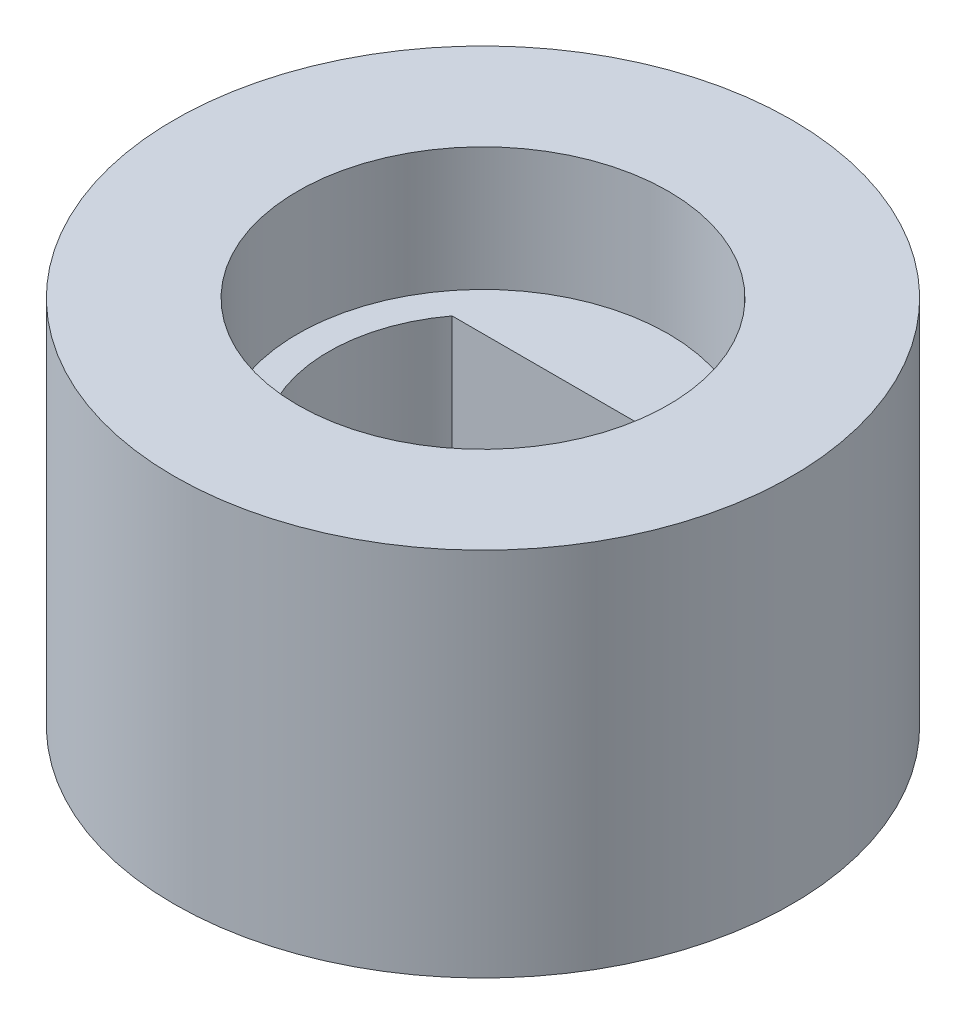
ISO-10303-21;
HEADER;
FILE_DESCRIPTION(('STEP AP214'),'2;1');
FILE_NAME('part.step','',(''),(''),'','','');
FILE_SCHEMA(('AUTOMOTIVE_DESIGN { 1 0 10303 214 1 1 1 1 }'));
ENDSEC;
DATA;
#1=APPLICATION_CONTEXT('core data for automotive mechanical design processes');
#2=APPLICATION_PROTOCOL_DEFINITION('international standard','automotive_design',2000,#1);
#3=PRODUCT_CONTEXT('',#1,'mechanical');
#4=PRODUCT('Part','Part','',(#3));
#5=PRODUCT_RELATED_PRODUCT_CATEGORY('part','',(#4));
#6=PRODUCT_DEFINITION_FORMATION('','',#4);
#7=PRODUCT_DEFINITION_CONTEXT('part definition',#1,'design');
#8=PRODUCT_DEFINITION('design','',#6,#7);
#9=PRODUCT_DEFINITION_SHAPE('','',#8);
#10=(LENGTH_UNIT() NAMED_UNIT(*) SI_UNIT(.MILLI.,.METRE.));
#11=(NAMED_UNIT(*) PLANE_ANGLE_UNIT() SI_UNIT($,.RADIAN.));
#12=(NAMED_UNIT(*) SI_UNIT($,.STERADIAN.) SOLID_ANGLE_UNIT());
#13=UNCERTAINTY_MEASURE_WITH_UNIT(LENGTH_MEASURE(1.E-05),#10,'distance_accuracy_value','');
#14=(GEOMETRIC_REPRESENTATION_CONTEXT(3) GLOBAL_UNCERTAINTY_ASSIGNED_CONTEXT((#13)) GLOBAL_UNIT_ASSIGNED_CONTEXT((#10,
#11,#12)) REPRESENTATION_CONTEXT('',''));
#15=CARTESIAN_POINT('',(0.,0.,0.));
#16=DIRECTION('',(0.,0.,1.));
#17=DIRECTION('',(1.,0.,0.));
#18=AXIS2_PLACEMENT_3D('',#15,#16,#17);
#19=CARTESIAN_POINT('',(0.,4.,0.));
#20=DIRECTION('',(0.,1.,0.));
#21=DIRECTION('',(0.,0.,1.));
#22=AXIS2_PLACEMENT_3D('',#19,#20,#21);
#23=PLANE('',#22);
#24=CARTESIAN_POINT('',(0.,4.,0.));
#25=DIRECTION('',(0.,1.,0.));
#26=DIRECTION('',(0.,0.,1.));
#27=AXIS2_PLACEMENT_3D('',#24,#25,#26);
#28=CIRCLE('',#27,2.5);
#29=CARTESIAN_POINT('',(-2.,4.,-1.5));
#30=VERTEX_POINT('',#29);
#31=CARTESIAN_POINT('',(2.,4.,-1.5));
#32=VERTEX_POINT('',#31);
#33=EDGE_CURVE('E79',#30,#32,#28,.T.);
#34=ORIENTED_EDGE('',*,*,#33,.F.);
#35=DIRECTION('',(1.,0.,0.));
#36=VECTOR('',#35,1.);
#37=CARTESIAN_POINT('',(0.,4.,-1.5));
#38=LINE('',#37,#36);
#39=EDGE_CURVE('E64',#30,#32,#38,.T.);
#40=ORIENTED_EDGE('',*,*,#39,.T.);
#41=EDGE_LOOP('',(#34,#40));
#42=FACE_BOUND('',#41,.T.);
#43=CARTESIAN_POINT('',(0.,4.,0.));
#44=DIRECTION('',(0.,1.,0.));
#45=DIRECTION('',(0.,0.,1.));
#46=AXIS2_PLACEMENT_3D('',#43,#44,#45);
#47=CIRCLE('',#46,3.);
#48=CARTESIAN_POINT('',(0.,4.,3.));
#49=VERTEX_POINT('',#48);
#50=EDGE_CURVE('E103',#49,#49,#47,.T.);
#51=ORIENTED_EDGE('',*,*,#50,.T.);
#52=EDGE_LOOP('',(#51));
#53=FACE_BOUND('',#52,.T.);
#54=ADVANCED_FACE('F47',(#42,#53),#23,.T.);
#55=CARTESIAN_POINT('',(0.,4.,0.));
#56=DIRECTION('',(0.,-1.,0.));
#57=DIRECTION('',(0.,0.,-1.));
#58=AXIS2_PLACEMENT_3D('',#55,#56,#57);
#59=CYLINDRICAL_SURFACE('',#58,2.5);
#60=CARTESIAN_POINT('',(0.,0.,0.));
#61=DIRECTION('',(0.,1.,0.));
#62=DIRECTION('',(0.,0.,1.));
#63=AXIS2_PLACEMENT_3D('',#60,#61,#62);
#64=CIRCLE('',#63,2.5);
#65=CARTESIAN_POINT('',(-2.,0.,-1.5));
#66=VERTEX_POINT('',#65);
#67=CARTESIAN_POINT('',(2.,0.,-1.5));
#68=VERTEX_POINT('',#67);
#69=EDGE_CURVE('E78',#66,#68,#64,.T.);
#70=ORIENTED_EDGE('',*,*,#69,.F.);
#71=DIRECTION('',(0.,-1.,0.));
#72=VECTOR('',#71,1.);
#73=CARTESIAN_POINT('',(-2.,4.,-1.5));
#74=LINE('',#73,#72);
#75=EDGE_CURVE('E12',#30,#66,#74,.T.);
#76=ORIENTED_EDGE('',*,*,#75,.F.);
#77=ORIENTED_EDGE('',*,*,#33,.T.);
#78=DIRECTION('',(0.,-1.,0.));
#79=VECTOR('',#78,1.);
#80=CARTESIAN_POINT('',(2.,4.,-1.5));
#81=LINE('',#80,#79);
#82=EDGE_CURVE('E57',#32,#68,#81,.T.);
#83=ORIENTED_EDGE('',*,*,#82,.T.);
#84=EDGE_LOOP('',(#70,#76,#77,#83));
#85=FACE_BOUND('',#84,.T.);
#86=ADVANCED_FACE('F76',(#85),#59,.F.);
#87=CARTESIAN_POINT('',(0.,4.,0.));
#88=DIRECTION('',(0.,-1.,0.));
#89=DIRECTION('',(0.,0.,-1.));
#90=AXIS2_PLACEMENT_3D('',#87,#88,#89);
#91=CYLINDRICAL_SURFACE('',#90,5.);
#92=CARTESIAN_POINT('',(0.,0.,0.));
#93=DIRECTION('',(0.,1.,0.));
#94=DIRECTION('',(0.,0.,1.));
#95=AXIS2_PLACEMENT_3D('',#92,#93,#94);
#96=CIRCLE('',#95,5.);
#97=CARTESIAN_POINT('',(0.,0.,5.));
#98=VERTEX_POINT('',#97);
#99=EDGE_CURVE('E88',#98,#98,#96,.T.);
#100=ORIENTED_EDGE('',*,*,#99,.T.);
#101=EDGE_LOOP('',(#100));
#102=FACE_BOUND('',#101,.T.);
#103=CARTESIAN_POINT('',(0.,6.,0.));
#104=DIRECTION('',(0.,1.,0.));
#105=DIRECTION('',(0.,0.,1.));
#106=AXIS2_PLACEMENT_3D('',#103,#104,#105);
#107=CIRCLE('',#106,5.);
#108=CARTESIAN_POINT('',(0.,6.,5.));
#109=VERTEX_POINT('',#108);
#110=EDGE_CURVE('E92',#109,#109,#107,.T.);
#111=ORIENTED_EDGE('',*,*,#110,.F.);
#112=EDGE_LOOP('',(#111));
#113=FACE_BOUND('',#112,.T.);
#114=ADVANCED_FACE('F49',(#102,#113),#91,.T.);
#115=CARTESIAN_POINT('',(0.,4.,-1.5));
#116=DIRECTION('',(0.,0.,-1.));
#117=DIRECTION('',(-1.,0.,0.));
#118=AXIS2_PLACEMENT_3D('',#115,#116,#117);
#119=PLANE('',#118);
#120=DIRECTION('',(1.,0.,0.));
#121=VECTOR('',#120,1.);
#122=CARTESIAN_POINT('',(0.,0.,-1.5));
#123=LINE('',#122,#121);
#124=EDGE_CURVE('E81',#66,#68,#123,.T.);
#125=ORIENTED_EDGE('',*,*,#124,.T.);
#126=ORIENTED_EDGE('',*,*,#82,.F.);
#127=ORIENTED_EDGE('',*,*,#39,.F.);
#128=ORIENTED_EDGE('',*,*,#75,.T.);
#129=EDGE_LOOP('',(#125,#126,#127,#128));
#130=FACE_BOUND('',#129,.T.);
#131=ADVANCED_FACE('F82',(#130),#119,.F.);
#132=CARTESIAN_POINT('',(0.,0.,0.));
#133=DIRECTION('',(0.,1.,0.));
#134=DIRECTION('',(0.,0.,1.));
#135=AXIS2_PLACEMENT_3D('',#132,#133,#134);
#136=PLANE('',#135);
#137=ORIENTED_EDGE('',*,*,#99,.F.);
#138=EDGE_LOOP('',(#137));
#139=FACE_BOUND('',#138,.T.);
#140=ORIENTED_EDGE('',*,*,#69,.T.);
#141=ORIENTED_EDGE('',*,*,#124,.F.);
#142=EDGE_LOOP('',(#140,#141));
#143=FACE_BOUND('',#142,.T.);
#144=ADVANCED_FACE('F86',(#139,#143),#136,.F.);
#145=CARTESIAN_POINT('',(0.,6.,0.));
#146=DIRECTION('',(0.,1.,0.));
#147=DIRECTION('',(0.,0.,1.));
#148=AXIS2_PLACEMENT_3D('',#145,#146,#147);
#149=PLANE('',#148);
#150=ORIENTED_EDGE('',*,*,#110,.T.);
#151=EDGE_LOOP('',(#150));
#152=FACE_BOUND('',#151,.T.);
#153=CARTESIAN_POINT('',(0.,6.,0.));
#154=DIRECTION('',(0.,1.,0.));
#155=DIRECTION('',(0.,0.,1.));
#156=AXIS2_PLACEMENT_3D('',#153,#154,#155);
#157=CIRCLE('',#156,3.);
#158=CARTESIAN_POINT('',(0.,6.,3.));
#159=VERTEX_POINT('',#158);
#160=EDGE_CURVE('E102',#159,#159,#157,.T.);
#161=ORIENTED_EDGE('',*,*,#160,.F.);
#162=EDGE_LOOP('',(#161));
#163=FACE_BOUND('',#162,.T.);
#164=ADVANCED_FACE('F114',(#152,#163),#149,.T.);
#165=CARTESIAN_POINT('',(0.,6.,0.));
#166=DIRECTION('',(0.,-1.,0.));
#167=DIRECTION('',(0.,0.,-1.));
#168=AXIS2_PLACEMENT_3D('',#165,#166,#167);
#169=CYLINDRICAL_SURFACE('',#168,3.);
#170=ORIENTED_EDGE('',*,*,#160,.T.);
#171=EDGE_LOOP('',(#170));
#172=FACE_BOUND('',#171,.T.);
#173=ORIENTED_EDGE('',*,*,#50,.F.);
#174=EDGE_LOOP('',(#173));
#175=FACE_BOUND('',#174,.T.);
#176=ADVANCED_FACE('F111',(#172,#175),#169,.F.);
#177=CLOSED_SHELL('',(#54,#86,#114,#131,#144,#164,#176));
#178=MANIFOLD_SOLID_BREP('B2',#177);
#179=ADVANCED_BREP_SHAPE_REPRESENTATION('',(#18,#178),#14);
#180=SHAPE_DEFINITION_REPRESENTATION(#9,#179);
ENDSEC;
END-ISO-10303-21;
